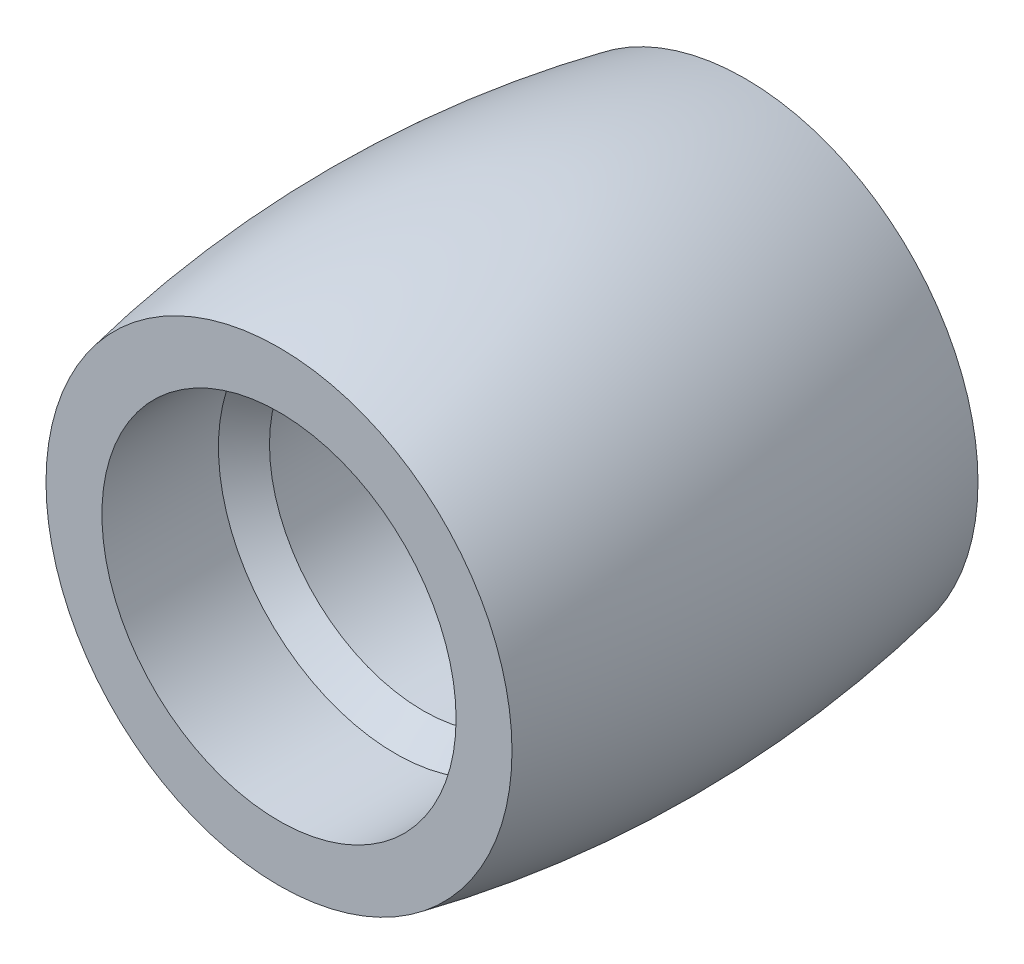
ISO-10303-21;
HEADER;
FILE_DESCRIPTION(('STEP AP214'),'2;1');
FILE_NAME('part.step','',(''),(''),'','','');
FILE_SCHEMA(('AUTOMOTIVE_DESIGN { 1 0 10303 214 1 1 1 1 }'));
ENDSEC;
DATA;
#1=APPLICATION_CONTEXT('core data for automotive mechanical design processes');
#2=APPLICATION_PROTOCOL_DEFINITION('international standard','automotive_design',2000,#1);
#3=PRODUCT_CONTEXT('',#1,'mechanical');
#4=PRODUCT('Part','Part','',(#3));
#5=PRODUCT_RELATED_PRODUCT_CATEGORY('part','',(#4));
#6=PRODUCT_DEFINITION_FORMATION('','',#4);
#7=PRODUCT_DEFINITION_CONTEXT('part definition',#1,'design');
#8=PRODUCT_DEFINITION('design','',#6,#7);
#9=PRODUCT_DEFINITION_SHAPE('','',#8);
#10=(LENGTH_UNIT() NAMED_UNIT(*) SI_UNIT(.MILLI.,.METRE.));
#11=(NAMED_UNIT(*) PLANE_ANGLE_UNIT() SI_UNIT($,.RADIAN.));
#12=(NAMED_UNIT(*) SI_UNIT($,.STERADIAN.) SOLID_ANGLE_UNIT());
#13=UNCERTAINTY_MEASURE_WITH_UNIT(LENGTH_MEASURE(1.E-05),#10,'distance_accuracy_value','');
#14=(GEOMETRIC_REPRESENTATION_CONTEXT(3) GLOBAL_UNCERTAINTY_ASSIGNED_CONTEXT((#13)) GLOBAL_UNIT_ASSIGNED_CONTEXT((#10,
#11,#12)) REPRESENTATION_CONTEXT('',''));
#15=CARTESIAN_POINT('',(0.,0.,0.));
#16=DIRECTION('',(0.,0.,1.));
#17=DIRECTION('',(1.,0.,0.));
#18=AXIS2_PLACEMENT_3D('',#15,#16,#17);
#19=CARTESIAN_POINT('',(0.,0.,0.));
#20=DIRECTION('',(0.,0.,1.));
#21=DIRECTION('',(1.,0.,0.));
#22=AXIS2_PLACEMENT_3D('',#19,#20,#21);
#23=DEGENERATE_TOROIDAL_SURFACE('',#22,39.4999999999999,50.4999999999999,.F.);
#24=CARTESIAN_POINT('',(0.,0.,-10.));
#25=DIRECTION('',(0.,0.,1.));
#26=DIRECTION('',(1.,0.,0.));
#27=AXIS2_PLACEMENT_3D('',#24,#25,#26);
#28=CIRCLE('',#27,10.);
#29=CARTESIAN_POINT('',(10.,0.,-10.));
#30=VERTEX_POINT('',#29);
#31=EDGE_CURVE('E10',#30,#30,#28,.T.);
#32=ORIENTED_EDGE('',*,*,#31,.T.);
#33=EDGE_LOOP('',(#32));
#34=FACE_BOUND('',#33,.T.);
#35=CARTESIAN_POINT('',(0.,0.,10.));
#36=DIRECTION('',(0.,0.,1.));
#37=DIRECTION('',(1.,0.,0.));
#38=AXIS2_PLACEMENT_3D('',#35,#36,#37);
#39=CIRCLE('',#38,10.);
#40=CARTESIAN_POINT('',(10.,0.,10.));
#41=VERTEX_POINT('',#40);
#42=EDGE_CURVE('E49',#41,#41,#39,.T.);
#43=ORIENTED_EDGE('',*,*,#42,.F.);
#44=EDGE_LOOP('',(#43));
#45=FACE_BOUND('',#44,.T.);
#46=ADVANCED_FACE('F30',(#34,#45),#23,.F.);
#47=CARTESIAN_POINT('',(0.,10.,-10.));
#48=DIRECTION('',(0.,0.,1.));
#49=DIRECTION('',(1.,0.,0.));
#50=AXIS2_PLACEMENT_3D('',#47,#48,#49);
#51=PLANE('',#50);
#52=ORIENTED_EDGE('',*,*,#31,.F.);
#53=EDGE_LOOP('',(#52));
#54=FACE_BOUND('',#53,.T.);
#55=CARTESIAN_POINT('',(0.,0.,-10.));
#56=DIRECTION('',(0.,0.,1.));
#57=DIRECTION('',(1.,0.,0.));
#58=AXIS2_PLACEMENT_3D('',#55,#56,#57);
#59=CIRCLE('',#58,7.6);
#60=CARTESIAN_POINT('',(7.6,0.,-10.));
#61=VERTEX_POINT('',#60);
#62=EDGE_CURVE('E36',#61,#61,#59,.T.);
#63=ORIENTED_EDGE('',*,*,#62,.T.);
#64=EDGE_LOOP('',(#63));
#65=FACE_BOUND('',#64,.T.);
#66=ADVANCED_FACE('F76',(#54,#65),#51,.F.);
#67=CARTESIAN_POINT('',(0.,0.,10.));
#68=DIRECTION('',(0.,0.,1.));
#69=DIRECTION('',(1.,0.,0.));
#70=AXIS2_PLACEMENT_3D('',#67,#68,#69);
#71=CYLINDRICAL_SURFACE('',#70,7.6);
#72=ORIENTED_EDGE('',*,*,#62,.F.);
#73=EDGE_LOOP('',(#72));
#74=FACE_BOUND('',#73,.T.);
#75=CARTESIAN_POINT('',(0.,0.,-5.));
#76=DIRECTION('',(0.,0.,1.));
#77=DIRECTION('',(1.,0.,0.));
#78=AXIS2_PLACEMENT_3D('',#75,#76,#77);
#79=CIRCLE('',#78,7.6);
#80=CARTESIAN_POINT('',(7.6,0.,-5.));
#81=VERTEX_POINT('',#80);
#82=EDGE_CURVE('E40',#81,#81,#79,.T.);
#83=ORIENTED_EDGE('',*,*,#82,.T.);
#84=EDGE_LOOP('',(#83));
#85=FACE_BOUND('',#84,.T.);
#86=ADVANCED_FACE('F80',(#74,#85),#71,.F.);
#87=CARTESIAN_POINT('',(0.,0.,-3.80824640740579));
#88=DIRECTION('',(0.,0.,-1.));
#89=DIRECTION('',(-1.,0.,0.));
#90=AXIS2_PLACEMENT_3D('',#87,#88,#89);
#91=CONICAL_SURFACE('',#90,6.6,0.698131700797734);
#92=ORIENTED_EDGE('',*,*,#82,.F.);
#93=EDGE_LOOP('',(#92));
#94=FACE_BOUND('',#93,.T.);
#95=CARTESIAN_POINT('',(0.,0.,-3.80824640740579));
#96=DIRECTION('',(0.,0.,1.));
#97=DIRECTION('',(1.,0.,0.));
#98=AXIS2_PLACEMENT_3D('',#95,#96,#97);
#99=CIRCLE('',#98,6.6);
#100=CARTESIAN_POINT('',(6.6,0.,-3.80824640740579));
#101=VERTEX_POINT('',#100);
#102=EDGE_CURVE('E44',#101,#101,#99,.T.);
#103=ORIENTED_EDGE('',*,*,#102,.T.);
#104=EDGE_LOOP('',(#103));
#105=FACE_BOUND('',#104,.T.);
#106=ADVANCED_FACE('F94',(#94,#105),#91,.F.);
#107=CARTESIAN_POINT('',(0.,0.,10.));
#108=DIRECTION('',(0.,0.,1.));
#109=DIRECTION('',(1.,0.,0.));
#110=AXIS2_PLACEMENT_3D('',#107,#108,#109);
#111=CYLINDRICAL_SURFACE('',#110,6.6);
#112=ORIENTED_EDGE('',*,*,#102,.F.);
#113=EDGE_LOOP('',(#112));
#114=FACE_BOUND('',#113,.T.);
#115=CARTESIAN_POINT('',(0.,0.,3.80824640740579));
#116=DIRECTION('',(0.,0.,1.));
#117=DIRECTION('',(1.,0.,0.));
#118=AXIS2_PLACEMENT_3D('',#115,#116,#117);
#119=CIRCLE('',#118,6.6);
#120=CARTESIAN_POINT('',(6.6,0.,3.80824640740579));
#121=VERTEX_POINT('',#120);
#122=EDGE_CURVE('E58',#121,#121,#119,.T.);
#123=ORIENTED_EDGE('',*,*,#122,.T.);
#124=EDGE_LOOP('',(#123));
#125=FACE_BOUND('',#124,.T.);
#126=ADVANCED_FACE('F62',(#114,#125),#111,.F.);
#127=CARTESIAN_POINT('',(0.,10.,10.));
#128=DIRECTION('',(0.,0.,-1.));
#129=DIRECTION('',(1.,0.,0.));
#130=AXIS2_PLACEMENT_3D('',#127,#128,#129);
#131=PLANE('',#130);
#132=ORIENTED_EDGE('',*,*,#42,.T.);
#133=EDGE_LOOP('',(#132));
#134=FACE_BOUND('',#133,.T.);
#135=CARTESIAN_POINT('',(0.,0.,10.));
#136=DIRECTION('',(0.,0.,1.));
#137=DIRECTION('',(1.,0.,0.));
#138=AXIS2_PLACEMENT_3D('',#135,#136,#137);
#139=CIRCLE('',#138,7.6);
#140=CARTESIAN_POINT('',(7.6,0.,10.));
#141=VERTEX_POINT('',#140);
#142=EDGE_CURVE('E52',#141,#141,#139,.T.);
#143=ORIENTED_EDGE('',*,*,#142,.F.);
#144=EDGE_LOOP('',(#143));
#145=FACE_BOUND('',#144,.T.);
#146=ADVANCED_FACE('F72',(#134,#145),#131,.F.);
#147=CARTESIAN_POINT('',(0.,0.,-10.));
#148=DIRECTION('',(0.,0.,-1.));
#149=DIRECTION('',(1.,0.,0.));
#150=AXIS2_PLACEMENT_3D('',#147,#148,#149);
#151=CYLINDRICAL_SURFACE('',#150,7.6);
#152=ORIENTED_EDGE('',*,*,#142,.T.);
#153=EDGE_LOOP('',(#152));
#154=FACE_BOUND('',#153,.T.);
#155=CARTESIAN_POINT('',(0.,0.,5.));
#156=DIRECTION('',(0.,0.,1.));
#157=DIRECTION('',(1.,0.,0.));
#158=AXIS2_PLACEMENT_3D('',#155,#156,#157);
#159=CIRCLE('',#158,7.6);
#160=CARTESIAN_POINT('',(7.6,0.,5.));
#161=VERTEX_POINT('',#160);
#162=EDGE_CURVE('E55',#161,#161,#159,.T.);
#163=ORIENTED_EDGE('',*,*,#162,.F.);
#164=EDGE_LOOP('',(#163));
#165=FACE_BOUND('',#164,.T.);
#166=ADVANCED_FACE('F66',(#154,#165),#151,.F.);
#167=CARTESIAN_POINT('',(0.,0.,3.80824640740579));
#168=DIRECTION('',(0.,0.,1.));
#169=DIRECTION('',(-1.,0.,0.));
#170=AXIS2_PLACEMENT_3D('',#167,#168,#169);
#171=CONICAL_SURFACE('',#170,6.6,0.698131700797734);
#172=ORIENTED_EDGE('',*,*,#162,.T.);
#173=EDGE_LOOP('',(#172));
#174=FACE_BOUND('',#173,.T.);
#175=ORIENTED_EDGE('',*,*,#122,.F.);
#176=EDGE_LOOP('',(#175));
#177=FACE_BOUND('',#176,.T.);
#178=ADVANCED_FACE('F64',(#174,#177),#171,.F.);
#179=CLOSED_SHELL('',(#46,#66,#86,#106,#126,#146,#166,#178));
#180=MANIFOLD_SOLID_BREP('B2',#179);
#181=ADVANCED_BREP_SHAPE_REPRESENTATION('',(#18,#180),#14);
#182=SHAPE_DEFINITION_REPRESENTATION(#9,#181);
ENDSEC;
END-ISO-10303-21;
